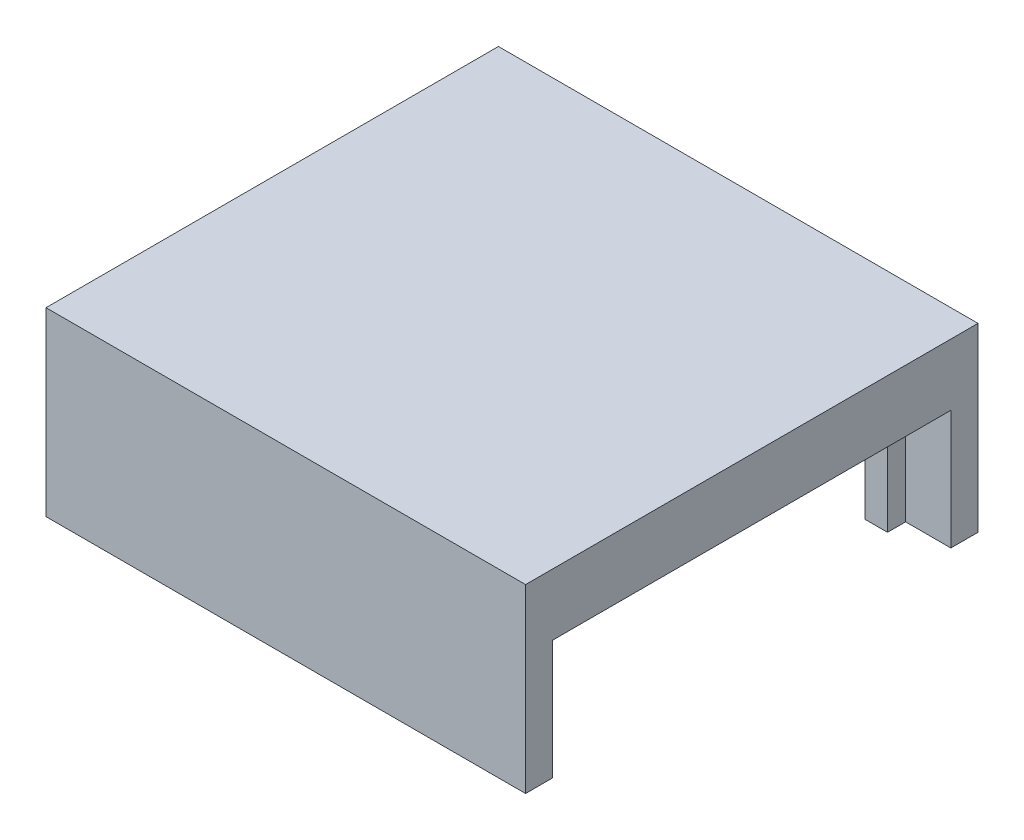
ISO-10303-21;
HEADER;
FILE_DESCRIPTION(('STEP AP214'),'2;1');
FILE_NAME('part.step','',(''),(''),'','','');
FILE_SCHEMA(('AUTOMOTIVE_DESIGN { 1 0 10303 214 1 1 1 1 }'));
ENDSEC;
DATA;
#1=APPLICATION_CONTEXT('core data for automotive mechanical design processes');
#2=APPLICATION_PROTOCOL_DEFINITION('international standard','automotive_design',2000,#1);
#3=PRODUCT_CONTEXT('',#1,'mechanical');
#4=PRODUCT('Part','Part','',(#3));
#5=PRODUCT_RELATED_PRODUCT_CATEGORY('part','',(#4));
#6=PRODUCT_DEFINITION_FORMATION('','',#4);
#7=PRODUCT_DEFINITION_CONTEXT('part definition',#1,'design');
#8=PRODUCT_DEFINITION('design','',#6,#7);
#9=PRODUCT_DEFINITION_SHAPE('','',#8);
#10=(LENGTH_UNIT() NAMED_UNIT(*) SI_UNIT(.MILLI.,.METRE.));
#11=(NAMED_UNIT(*) PLANE_ANGLE_UNIT() SI_UNIT($,.RADIAN.));
#12=(NAMED_UNIT(*) SI_UNIT($,.STERADIAN.) SOLID_ANGLE_UNIT());
#13=UNCERTAINTY_MEASURE_WITH_UNIT(LENGTH_MEASURE(1.E-05),#10,'distance_accuracy_value','');
#14=(GEOMETRIC_REPRESENTATION_CONTEXT(3) GLOBAL_UNCERTAINTY_ASSIGNED_CONTEXT((#13)) GLOBAL_UNIT_ASSIGNED_CONTEXT((#10,
#11,#12)) REPRESENTATION_CONTEXT('',''));
#15=CARTESIAN_POINT('',(0.,0.,0.));
#16=DIRECTION('',(0.,0.,1.));
#17=DIRECTION('',(1.,0.,0.));
#18=AXIS2_PLACEMENT_3D('',#15,#16,#17);
#19=CARTESIAN_POINT('',(0.,0.,0.));
#20=DIRECTION('',(0.,1.,0.));
#21=DIRECTION('',(0.,0.,1.));
#22=AXIS2_PLACEMENT_3D('',#19,#20,#21);
#23=PLANE('',#22);
#24=DIRECTION('',(-1.,0.,0.));
#25=VECTOR('',#24,1.);
#26=CARTESIAN_POINT('',(53.,0.,-50.));
#27=LINE('',#26,#25);
#28=CARTESIAN_POINT('',(-38.,0.,-50.));
#29=VERTEX_POINT('',#28);
#30=CARTESIAN_POINT('',(-53.,0.,-50.));
#31=VERTEX_POINT('',#30);
#32=EDGE_CURVE('E335',#29,#31,#27,.T.);
#33=ORIENTED_EDGE('',*,*,#32,.F.);
#34=DIRECTION('',(0.,0.,-1.));
#35=VECTOR('',#34,1.);
#36=CARTESIAN_POINT('',(-38.,0.,38.7185311582816));
#37=LINE('',#36,#35);
#38=CARTESIAN_POINT('',(-38.,0.,-40.));
#39=VERTEX_POINT('',#38);
#40=EDGE_CURVE('E200',#39,#29,#37,.T.);
#41=ORIENTED_EDGE('',*,*,#40,.F.);
#42=DIRECTION('',(1.,0.,0.));
#43=VECTOR('',#42,1.);
#44=CARTESIAN_POINT('',(-43.,0.,-40.));
#45=LINE('',#44,#43);
#46=CARTESIAN_POINT('',(-43.,0.,-40.));
#47=VERTEX_POINT('',#46);
#48=EDGE_CURVE('E281',#47,#39,#45,.T.);
#49=ORIENTED_EDGE('',*,*,#48,.F.);
#50=DIRECTION('',(0.,0.,-1.));
#51=VECTOR('',#50,1.);
#52=CARTESIAN_POINT('',(-43.,0.,-45.));
#53=LINE('',#52,#51);
#54=CARTESIAN_POINT('',(-43.,0.,-45.));
#55=VERTEX_POINT('',#54);
#56=EDGE_CURVE('E229',#47,#55,#53,.T.);
#57=ORIENTED_EDGE('',*,*,#56,.T.);
#58=DIRECTION('',(-1.,0.,0.));
#59=VECTOR('',#58,1.);
#60=CARTESIAN_POINT('',(53.0666262289621,0.,-45.));
#61=LINE('',#60,#59);
#62=CARTESIAN_POINT('',(-53.,0.,-45.));
#63=VERTEX_POINT('',#62);
#64=EDGE_CURVE('E237',#55,#63,#61,.T.);
#65=ORIENTED_EDGE('',*,*,#64,.T.);
#66=DIRECTION('',(0.,0.,1.));
#67=VECTOR('',#66,1.);
#68=CARTESIAN_POINT('',(-53.,0.,50.));
#69=LINE('',#68,#67);
#70=EDGE_CURVE('E326',#31,#63,#69,.T.);
#71=ORIENTED_EDGE('',*,*,#70,.F.);
#72=EDGE_LOOP('',(#33,#41,#49,#57,#65,#71));
#73=FACE_BOUND('',#72,.T.);
#74=ADVANCED_FACE('F35',(#73),#23,.F.);
#75=CARTESIAN_POINT('',(38.,0.,-40.));
#76=VERTEX_POINT('',#75);
#77=CARTESIAN_POINT('',(43.,0.,-40.));
#78=VERTEX_POINT('',#77);
#79=EDGE_CURVE('E285',#76,#78,#45,.T.);
#80=ORIENTED_EDGE('',*,*,#79,.F.);
#81=DIRECTION('',(0.,0.,-1.));
#82=VECTOR('',#81,1.);
#83=CARTESIAN_POINT('',(38.,0.,38.7185311582816));
#84=LINE('',#83,#82);
#85=CARTESIAN_POINT('',(38.,0.,-50.));
#86=VERTEX_POINT('',#85);
#87=EDGE_CURVE('E212',#76,#86,#84,.T.);
#88=ORIENTED_EDGE('',*,*,#87,.T.);
#89=CARTESIAN_POINT('',(53.,0.,-50.));
#90=VERTEX_POINT('',#89);
#91=EDGE_CURVE('E319',#90,#86,#27,.T.);
#92=ORIENTED_EDGE('',*,*,#91,.F.);
#93=DIRECTION('',(0.,0.,-1.));
#94=VECTOR('',#93,1.);
#95=CARTESIAN_POINT('',(53.,0.,50.));
#96=LINE('',#95,#94);
#97=CARTESIAN_POINT('',(53.,0.,-44.));
#98=VERTEX_POINT('',#97);
#99=EDGE_CURVE('E331',#98,#90,#96,.T.);
#100=ORIENTED_EDGE('',*,*,#99,.F.);
#101=DIRECTION('',(1.,0.,0.));
#102=VECTOR('',#101,1.);
#103=CARTESIAN_POINT('',(-48.8626192298182,0.,-44.));
#104=LINE('',#103,#102);
#105=CARTESIAN_POINT('',(43.,0.,-44.));
#106=VERTEX_POINT('',#105);
#107=EDGE_CURVE('E264',#106,#98,#104,.T.);
#108=ORIENTED_EDGE('',*,*,#107,.F.);
#109=DIRECTION('',(0.,0.,1.));
#110=VECTOR('',#109,1.);
#111=CARTESIAN_POINT('',(43.,0.,44.));
#112=LINE('',#111,#110);
#113=EDGE_CURVE('E268',#106,#78,#112,.T.);
#114=ORIENTED_EDGE('',*,*,#113,.T.);
#115=EDGE_LOOP('',(#80,#88,#92,#100,#108,#114));
#116=FACE_BOUND('',#115,.T.);
#117=ADVANCED_FACE('F413',(#116),#23,.F.);
#118=CARTESIAN_POINT('',(-53.,40.,50.));
#119=DIRECTION('',(1.,0.,0.));
#120=DIRECTION('',(0.,0.,-1.));
#121=AXIS2_PLACEMENT_3D('',#118,#119,#120);
#122=PLANE('',#121);
#123=ORIENTED_EDGE('',*,*,#70,.T.);
#124=DIRECTION('',(0.,-1.,0.));
#125=VECTOR('',#124,1.);
#126=CARTESIAN_POINT('',(-53.,0.,-45.));
#127=LINE('',#126,#125);
#128=CARTESIAN_POINT('',(-53.,33.5975694807689,-45.));
#129=VERTEX_POINT('',#128);
#130=EDGE_CURVE('E217',#129,#63,#127,.T.);
#131=ORIENTED_EDGE('',*,*,#130,.F.);
#132=DIRECTION('',(0.,0.,-1.));
#133=VECTOR('',#132,1.);
#134=CARTESIAN_POINT('',(-53.,33.5975694807689,-45.));
#135=LINE('',#134,#133);
#136=CARTESIAN_POINT('',(-53.,33.5975694807689,45.));
#137=VERTEX_POINT('',#136);
#138=EDGE_CURVE('E234',#137,#129,#135,.T.);
#139=ORIENTED_EDGE('',*,*,#138,.F.);
#140=DIRECTION('',(0.,1.,0.));
#141=VECTOR('',#140,1.);
#142=CARTESIAN_POINT('',(-53.,0.,45.));
#143=LINE('',#142,#141);
#144=CARTESIAN_POINT('',(-53.,0.,45.));
#145=VERTEX_POINT('',#144);
#146=EDGE_CURVE('E231',#145,#137,#143,.T.);
#147=ORIENTED_EDGE('',*,*,#146,.F.);
#148=CARTESIAN_POINT('',(-53.,0.,50.));
#149=VERTEX_POINT('',#148);
#150=EDGE_CURVE('E314',#145,#149,#69,.T.);
#151=ORIENTED_EDGE('',*,*,#150,.T.);
#152=DIRECTION('',(0.,-1.,0.));
#153=VECTOR('',#152,1.);
#154=CARTESIAN_POINT('',(-53.,40.,50.));
#155=LINE('',#154,#153);
#156=CARTESIAN_POINT('',(-53.,40.,50.));
#157=VERTEX_POINT('',#156);
#158=EDGE_CURVE('E43',#157,#149,#155,.T.);
#159=ORIENTED_EDGE('',*,*,#158,.F.);
#160=DIRECTION('',(0.,0.,1.));
#161=VECTOR('',#160,1.);
#162=CARTESIAN_POINT('',(-53.,40.,50.));
#163=LINE('',#162,#161);
#164=CARTESIAN_POINT('',(-53.,40.,-50.));
#165=VERTEX_POINT('',#164);
#166=EDGE_CURVE('E315',#165,#157,#163,.T.);
#167=ORIENTED_EDGE('',*,*,#166,.F.);
#168=DIRECTION('',(0.,-1.,0.));
#169=VECTOR('',#168,1.);
#170=CARTESIAN_POINT('',(-53.,40.,-50.));
#171=LINE('',#170,#169);
#172=EDGE_CURVE('E325',#165,#31,#171,.T.);
#173=ORIENTED_EDGE('',*,*,#172,.T.);
#174=EDGE_LOOP('',(#123,#131,#139,#147,#151,#159,#167,#173));
#175=FACE_BOUND('',#174,.T.);
#176=ADVANCED_FACE('F37',(#175),#122,.F.);
#177=CARTESIAN_POINT('',(53.,40.,50.));
#178=DIRECTION('',(0.,0.,-1.));
#179=DIRECTION('',(-1.,0.,0.));
#180=AXIS2_PLACEMENT_3D('',#177,#178,#179);
#181=PLANE('',#180);
#182=DIRECTION('',(1.,0.,0.));
#183=VECTOR('',#182,1.);
#184=CARTESIAN_POINT('',(53.,0.,50.));
#185=LINE('',#184,#183);
#186=CARTESIAN_POINT('',(53.,0.,50.));
#187=VERTEX_POINT('',#186);
#188=EDGE_CURVE('E329',#149,#187,#185,.T.);
#189=ORIENTED_EDGE('',*,*,#188,.T.);
#190=DIRECTION('',(0.,-1.,0.));
#191=VECTOR('',#190,1.);
#192=CARTESIAN_POINT('',(53.,40.,50.));
#193=LINE('',#192,#191);
#194=CARTESIAN_POINT('',(53.,40.,50.));
#195=VERTEX_POINT('',#194);
#196=EDGE_CURVE('E342',#195,#187,#193,.T.);
#197=ORIENTED_EDGE('',*,*,#196,.F.);
#198=DIRECTION('',(1.,0.,0.));
#199=VECTOR('',#198,1.);
#200=CARTESIAN_POINT('',(53.,40.,50.));
#201=LINE('',#200,#199);
#202=EDGE_CURVE('E318',#157,#195,#201,.T.);
#203=ORIENTED_EDGE('',*,*,#202,.F.);
#204=ORIENTED_EDGE('',*,*,#158,.T.);
#205=EDGE_LOOP('',(#189,#197,#203,#204));
#206=FACE_BOUND('',#205,.T.);
#207=ADVANCED_FACE('F347',(#206),#181,.F.);
#208=CARTESIAN_POINT('',(53.,40.,50.));
#209=DIRECTION('',(-1.,0.,0.));
#210=DIRECTION('',(0.,0.,1.));
#211=AXIS2_PLACEMENT_3D('',#208,#209,#210);
#212=PLANE('',#211);
#213=CARTESIAN_POINT('',(53.,0.,44.));
#214=VERTEX_POINT('',#213);
#215=EDGE_CURVE('E332',#187,#214,#96,.T.);
#216=ORIENTED_EDGE('',*,*,#215,.T.);
#217=DIRECTION('',(0.,1.,0.));
#218=VECTOR('',#217,1.);
#219=CARTESIAN_POINT('',(53.,40.,44.));
#220=LINE('',#219,#218);
#221=CARTESIAN_POINT('',(53.,26.3579364094113,44.));
#222=VERTEX_POINT('',#221);
#223=EDGE_CURVE('E277',#214,#222,#220,.T.);
#224=ORIENTED_EDGE('',*,*,#223,.T.);
#225=DIRECTION('',(0.,0.,-1.));
#226=VECTOR('',#225,1.);
#227=CARTESIAN_POINT('',(53.,26.3579364094113,50.));
#228=LINE('',#227,#226);
#229=CARTESIAN_POINT('',(53.,26.3579364094113,-44.));
#230=VERTEX_POINT('',#229);
#231=EDGE_CURVE('E271',#222,#230,#228,.T.);
#232=ORIENTED_EDGE('',*,*,#231,.T.);
#233=DIRECTION('',(0.,-1.,0.));
#234=VECTOR('',#233,1.);
#235=CARTESIAN_POINT('',(53.,40.,-44.));
#236=LINE('',#235,#234);
#237=EDGE_CURVE('E274',#230,#98,#236,.T.);
#238=ORIENTED_EDGE('',*,*,#237,.T.);
#239=ORIENTED_EDGE('',*,*,#99,.T.);
#240=DIRECTION('',(0.,-1.,0.));
#241=VECTOR('',#240,1.);
#242=CARTESIAN_POINT('',(53.,40.,-50.));
#243=LINE('',#242,#241);
#244=CARTESIAN_POINT('',(53.,40.,-50.));
#245=VERTEX_POINT('',#244);
#246=EDGE_CURVE('E339',#245,#90,#243,.T.);
#247=ORIENTED_EDGE('',*,*,#246,.F.);
#248=DIRECTION('',(0.,0.,-1.));
#249=VECTOR('',#248,1.);
#250=CARTESIAN_POINT('',(53.,40.,50.));
#251=LINE('',#250,#249);
#252=EDGE_CURVE('E321',#195,#245,#251,.T.);
#253=ORIENTED_EDGE('',*,*,#252,.F.);
#254=ORIENTED_EDGE('',*,*,#196,.T.);
#255=EDGE_LOOP('',(#216,#224,#232,#238,#239,#247,#253,#254));
#256=FACE_BOUND('',#255,.T.);
#257=ADVANCED_FACE('F362',(#256),#212,.F.);
#258=CARTESIAN_POINT('',(53.,40.,-50.));
#259=DIRECTION('',(0.,0.,1.));
#260=DIRECTION('',(1.,0.,0.));
#261=AXIS2_PLACEMENT_3D('',#258,#259,#260);
#262=PLANE('',#261);
#263=DIRECTION('',(1.,0.,0.));
#264=VECTOR('',#263,1.);
#265=CARTESIAN_POINT('',(-38.,20.5087090699868,-50.));
#266=LINE('',#265,#264);
#267=CARTESIAN_POINT('',(-38.,20.5087090699868,-50.));
#268=VERTEX_POINT('',#267);
#269=CARTESIAN_POINT('',(38.,20.5087090699868,-50.));
#270=VERTEX_POINT('',#269);
#271=EDGE_CURVE('E188',#268,#270,#266,.T.);
#272=ORIENTED_EDGE('',*,*,#271,.F.);
#273=DIRECTION('',(0.,1.,0.));
#274=VECTOR('',#273,1.);
#275=CARTESIAN_POINT('',(-38.,0.,-50.));
#276=LINE('',#275,#274);
#277=EDGE_CURVE('E197',#29,#268,#276,.T.);
#278=ORIENTED_EDGE('',*,*,#277,.F.);
#279=ORIENTED_EDGE('',*,*,#32,.T.);
#280=ORIENTED_EDGE('',*,*,#172,.F.);
#281=DIRECTION('',(-1.,0.,0.));
#282=VECTOR('',#281,1.);
#283=CARTESIAN_POINT('',(53.,40.,-50.));
#284=LINE('',#283,#282);
#285=EDGE_CURVE('E323',#245,#165,#284,.T.);
#286=ORIENTED_EDGE('',*,*,#285,.F.);
#287=ORIENTED_EDGE('',*,*,#246,.T.);
#288=ORIENTED_EDGE('',*,*,#91,.T.);
#289=DIRECTION('',(0.,-1.,0.));
#290=VECTOR('',#289,1.);
#291=CARTESIAN_POINT('',(38.,0.,-50.));
#292=LINE('',#291,#290);
#293=EDGE_CURVE('E194',#270,#86,#292,.T.);
#294=ORIENTED_EDGE('',*,*,#293,.F.);
#295=EDGE_LOOP('',(#272,#278,#279,#280,#286,#287,#288,#294));
#296=FACE_BOUND('',#295,.T.);
#297=ADVANCED_FACE('F204',(#296),#262,.F.);
#298=CARTESIAN_POINT('',(0.,40.,0.));
#299=DIRECTION('',(0.,1.,0.));
#300=DIRECTION('',(0.,0.,1.));
#301=AXIS2_PLACEMENT_3D('',#298,#299,#300);
#302=PLANE('',#301);
#303=ORIENTED_EDGE('',*,*,#166,.T.);
#304=ORIENTED_EDGE('',*,*,#202,.T.);
#305=ORIENTED_EDGE('',*,*,#252,.T.);
#306=ORIENTED_EDGE('',*,*,#285,.T.);
#307=EDGE_LOOP('',(#303,#304,#305,#306));
#308=FACE_BOUND('',#307,.T.);
#309=ADVANCED_FACE('F367',(#308),#302,.T.);
#310=ORIENTED_EDGE('',*,*,#150,.F.);
#311=DIRECTION('',(-1.,0.,0.));
#312=VECTOR('',#311,1.);
#313=CARTESIAN_POINT('',(53.0666262289621,0.,45.));
#314=LINE('',#313,#312);
#315=CARTESIAN_POINT('',(-43.,0.,45.));
#316=VERTEX_POINT('',#315);
#317=EDGE_CURVE('E241',#316,#145,#314,.T.);
#318=ORIENTED_EDGE('',*,*,#317,.F.);
#319=CARTESIAN_POINT('',(-43.,0.,40.));
#320=VERTEX_POINT('',#319);
#321=EDGE_CURVE('E245',#316,#320,#53,.T.);
#322=ORIENTED_EDGE('',*,*,#321,.T.);
#323=DIRECTION('',(-1.,0.,0.));
#324=VECTOR('',#323,1.);
#325=CARTESIAN_POINT('',(-43.,0.,40.));
#326=LINE('',#325,#324);
#327=CARTESIAN_POINT('',(43.,0.,40.));
#328=VERTEX_POINT('',#327);
#329=EDGE_CURVE('E280',#328,#320,#326,.T.);
#330=ORIENTED_EDGE('',*,*,#329,.F.);
#331=CARTESIAN_POINT('',(43.,0.,44.));
#332=VERTEX_POINT('',#331);
#333=EDGE_CURVE('E258',#328,#332,#112,.T.);
#334=ORIENTED_EDGE('',*,*,#333,.T.);
#335=DIRECTION('',(1.,0.,0.));
#336=VECTOR('',#335,1.);
#337=CARTESIAN_POINT('',(-48.8626192298182,0.,44.));
#338=LINE('',#337,#336);
#339=EDGE_CURVE('E250',#332,#214,#338,.T.);
#340=ORIENTED_EDGE('',*,*,#339,.T.);
#341=ORIENTED_EDGE('',*,*,#215,.F.);
#342=ORIENTED_EDGE('',*,*,#188,.F.);
#343=EDGE_LOOP('',(#310,#318,#322,#330,#334,#340,#341,#342));
#344=FACE_BOUND('',#343,.T.);
#345=ADVANCED_FACE('F358',(#344),#23,.F.);
#346=CARTESIAN_POINT('',(0.,35.,0.));
#347=DIRECTION('',(0.,1.,0.));
#348=DIRECTION('',(0.,0.,1.));
#349=AXIS2_PLACEMENT_3D('',#346,#347,#348);
#350=PLANE('',#349);
#351=DIRECTION('',(0.,0.,1.));
#352=VECTOR('',#351,1.);
#353=CARTESIAN_POINT('',(43.,35.,40.));
#354=LINE('',#353,#352);
#355=CARTESIAN_POINT('',(43.,35.,-40.));
#356=VERTEX_POINT('',#355);
#357=CARTESIAN_POINT('',(43.,35.,40.));
#358=VERTEX_POINT('',#357);
#359=EDGE_CURVE('E291',#356,#358,#354,.T.);
#360=ORIENTED_EDGE('',*,*,#359,.T.);
#361=DIRECTION('',(-1.,0.,0.));
#362=VECTOR('',#361,1.);
#363=CARTESIAN_POINT('',(-43.,35.,40.));
#364=LINE('',#363,#362);
#365=CARTESIAN_POINT('',(-43.,35.,40.));
#366=VERTEX_POINT('',#365);
#367=EDGE_CURVE('E284',#358,#366,#364,.T.);
#368=ORIENTED_EDGE('',*,*,#367,.T.);
#369=DIRECTION('',(0.,0.,-1.));
#370=VECTOR('',#369,1.);
#371=CARTESIAN_POINT('',(-43.,35.,40.));
#372=LINE('',#371,#370);
#373=CARTESIAN_POINT('',(-43.,35.,-40.));
#374=VERTEX_POINT('',#373);
#375=EDGE_CURVE('E301',#366,#374,#372,.T.);
#376=ORIENTED_EDGE('',*,*,#375,.T.);
#377=DIRECTION('',(1.,0.,0.));
#378=VECTOR('',#377,1.);
#379=CARTESIAN_POINT('',(-43.,35.,-40.));
#380=LINE('',#379,#378);
#381=EDGE_CURVE('E296',#374,#356,#380,.T.);
#382=ORIENTED_EDGE('',*,*,#381,.T.);
#383=EDGE_LOOP('',(#360,#368,#376,#382));
#384=FACE_BOUND('',#383,.T.);
#385=ADVANCED_FACE('F439',(#384),#350,.F.);
#386=CARTESIAN_POINT('',(-43.,157.456374880208,40.));
#387=DIRECTION('',(0.,0.,1.));
#388=DIRECTION('',(1.,0.,0.));
#389=AXIS2_PLACEMENT_3D('',#386,#387,#388);
#390=PLANE('',#389);
#391=DIRECTION('',(0.,-1.,0.));
#392=VECTOR('',#391,1.);
#393=CARTESIAN_POINT('',(43.,157.456374880208,40.));
#394=LINE('',#393,#392);
#395=CARTESIAN_POINT('',(43.,26.3579364094113,40.));
#396=VERTEX_POINT('',#395);
#397=EDGE_CURVE('E311',#358,#396,#394,.T.);
#398=ORIENTED_EDGE('',*,*,#397,.T.);
#399=EDGE_CURVE('E294',#396,#328,#394,.T.);
#400=ORIENTED_EDGE('',*,*,#399,.T.);
#401=ORIENTED_EDGE('',*,*,#329,.T.);
#402=DIRECTION('',(0.,-1.,0.));
#403=VECTOR('',#402,1.);
#404=CARTESIAN_POINT('',(-43.,157.456374880208,40.));
#405=LINE('',#404,#403);
#406=CARTESIAN_POINT('',(-43.,33.5975694807689,40.));
#407=VERTEX_POINT('',#406);
#408=EDGE_CURVE('E248',#407,#320,#405,.T.);
#409=ORIENTED_EDGE('',*,*,#408,.F.);
#410=DIRECTION('',(0.,-1.,0.));
#411=VECTOR('',#410,1.);
#412=CARTESIAN_POINT('',(-43.,157.456374880208,40.));
#413=LINE('',#412,#411);
#414=EDGE_CURVE('E290',#366,#407,#413,.T.);
#415=ORIENTED_EDGE('',*,*,#414,.F.);
#416=ORIENTED_EDGE('',*,*,#367,.F.);
#417=EDGE_LOOP('',(#398,#400,#401,#409,#415,#416));
#418=FACE_BOUND('',#417,.T.);
#419=ADVANCED_FACE('F392',(#418),#390,.F.);
#420=CARTESIAN_POINT('',(-43.,157.456374880208,40.));
#421=DIRECTION('',(-1.,0.,0.));
#422=DIRECTION('',(0.,0.,1.));
#423=AXIS2_PLACEMENT_3D('',#420,#421,#422);
#424=PLANE('',#423);
#425=ORIENTED_EDGE('',*,*,#414,.T.);
#426=DIRECTION('',(0.,0.,1.));
#427=VECTOR('',#426,1.);
#428=CARTESIAN_POINT('',(-43.,33.5975694807689,-45.));
#429=LINE('',#428,#427);
#430=CARTESIAN_POINT('',(-43.,33.5975694807689,-40.));
#431=VERTEX_POINT('',#430);
#432=EDGE_CURVE('E227',#431,#407,#429,.T.);
#433=ORIENTED_EDGE('',*,*,#432,.F.);
#434=DIRECTION('',(0.,-1.,0.));
#435=VECTOR('',#434,1.);
#436=CARTESIAN_POINT('',(-43.,157.456374880208,-40.));
#437=LINE('',#436,#435);
#438=EDGE_CURVE('E300',#374,#431,#437,.T.);
#439=ORIENTED_EDGE('',*,*,#438,.F.);
#440=ORIENTED_EDGE('',*,*,#375,.F.);
#441=EDGE_LOOP('',(#425,#433,#439,#440));
#442=FACE_BOUND('',#441,.T.);
#443=ADVANCED_FACE('F454',(#442),#424,.F.);
#444=CARTESIAN_POINT('',(-43.,157.456374880208,-40.));
#445=DIRECTION('',(0.,0.,-1.));
#446=DIRECTION('',(-1.,0.,0.));
#447=AXIS2_PLACEMENT_3D('',#444,#445,#446);
#448=PLANE('',#447);
#449=ORIENTED_EDGE('',*,*,#48,.T.);
#450=DIRECTION('',(0.,-1.,0.));
#451=VECTOR('',#450,1.);
#452=CARTESIAN_POINT('',(-38.,0.,-40.));
#453=LINE('',#452,#451);
#454=CARTESIAN_POINT('',(-38.,20.5087090699868,-40.));
#455=VERTEX_POINT('',#454);
#456=EDGE_CURVE('E218',#455,#39,#453,.T.);
#457=ORIENTED_EDGE('',*,*,#456,.F.);
#458=DIRECTION('',(-1.,0.,0.));
#459=VECTOR('',#458,1.);
#460=CARTESIAN_POINT('',(-38.,20.5087090699868,-40.));
#461=LINE('',#460,#459);
#462=CARTESIAN_POINT('',(38.,20.5087090699868,-40.));
#463=VERTEX_POINT('',#462);
#464=EDGE_CURVE('E191',#463,#455,#461,.T.);
#465=ORIENTED_EDGE('',*,*,#464,.F.);
#466=DIRECTION('',(0.,1.,0.));
#467=VECTOR('',#466,1.);
#468=CARTESIAN_POINT('',(38.,0.,-40.));
#469=LINE('',#468,#467);
#470=EDGE_CURVE('E211',#76,#463,#469,.T.);
#471=ORIENTED_EDGE('',*,*,#470,.F.);
#472=ORIENTED_EDGE('',*,*,#79,.T.);
#473=DIRECTION('',(0.,-1.,0.));
#474=VECTOR('',#473,1.);
#475=CARTESIAN_POINT('',(43.,157.456374880208,-40.));
#476=LINE('',#475,#474);
#477=CARTESIAN_POINT('',(43.,26.3579364094113,-40.));
#478=VERTEX_POINT('',#477);
#479=EDGE_CURVE('E299',#478,#78,#476,.T.);
#480=ORIENTED_EDGE('',*,*,#479,.F.);
#481=EDGE_CURVE('E295',#356,#478,#476,.T.);
#482=ORIENTED_EDGE('',*,*,#481,.F.);
#483=ORIENTED_EDGE('',*,*,#381,.F.);
#484=ORIENTED_EDGE('',*,*,#438,.T.);
#485=EDGE_CURVE('E304',#431,#47,#437,.T.);
#486=ORIENTED_EDGE('',*,*,#485,.T.);
#487=EDGE_LOOP('',(#449,#457,#465,#471,#472,#480,#482,#483,#484,#486));
#488=FACE_BOUND('',#487,.T.);
#489=ADVANCED_FACE('F405',(#488),#448,.F.);
#490=CARTESIAN_POINT('',(43.,157.456374880208,40.));
#491=DIRECTION('',(1.,0.,0.));
#492=DIRECTION('',(0.,0.,-1.));
#493=AXIS2_PLACEMENT_3D('',#490,#491,#492);
#494=PLANE('',#493);
#495=ORIENTED_EDGE('',*,*,#481,.T.);
#496=DIRECTION('',(0.,0.,1.));
#497=VECTOR('',#496,1.);
#498=CARTESIAN_POINT('',(43.,26.3579364094113,40.));
#499=LINE('',#498,#497);
#500=EDGE_CURVE('E12',#478,#396,#499,.T.);
#501=ORIENTED_EDGE('',*,*,#500,.T.);
#502=ORIENTED_EDGE('',*,*,#397,.F.);
#503=ORIENTED_EDGE('',*,*,#359,.F.);
#504=EDGE_LOOP('',(#495,#501,#502,#503));
#505=FACE_BOUND('',#504,.T.);
#506=ADVANCED_FACE('F398',(#505),#494,.F.);
#507=CARTESIAN_POINT('',(-48.8626192298182,0.,44.));
#508=DIRECTION('',(0.,0.,1.));
#509=DIRECTION('',(1.,0.,0.));
#510=AXIS2_PLACEMENT_3D('',#507,#508,#509);
#511=PLANE('',#510);
#512=ORIENTED_EDGE('',*,*,#339,.F.);
#513=DIRECTION('',(0.,1.,0.));
#514=VECTOR('',#513,1.);
#515=CARTESIAN_POINT('',(43.,0.,44.));
#516=LINE('',#515,#514);
#517=CARTESIAN_POINT('',(43.,26.3579364094113,44.));
#518=VERTEX_POINT('',#517);
#519=EDGE_CURVE('E256',#332,#518,#516,.T.);
#520=ORIENTED_EDGE('',*,*,#519,.T.);
#521=DIRECTION('',(1.,0.,0.));
#522=VECTOR('',#521,1.);
#523=CARTESIAN_POINT('',(-48.8626192298182,26.3579364094113,44.));
#524=LINE('',#523,#522);
#525=EDGE_CURVE('E254',#518,#222,#524,.T.);
#526=ORIENTED_EDGE('',*,*,#525,.T.);
#527=ORIENTED_EDGE('',*,*,#223,.F.);
#528=EDGE_LOOP('',(#512,#520,#526,#527));
#529=FACE_BOUND('',#528,.T.);
#530=ADVANCED_FACE('F420',(#529),#511,.F.);
#531=CARTESIAN_POINT('',(-48.8626192298182,0.,-44.));
#532=DIRECTION('',(0.,0.,-1.));
#533=DIRECTION('',(-1.,0.,0.));
#534=AXIS2_PLACEMENT_3D('',#531,#532,#533);
#535=PLANE('',#534);
#536=DIRECTION('',(1.,0.,0.));
#537=VECTOR('',#536,1.);
#538=CARTESIAN_POINT('',(-48.8626192298182,26.3579364094113,-44.));
#539=LINE('',#538,#537);
#540=CARTESIAN_POINT('',(43.,26.3579364094113,-44.));
#541=VERTEX_POINT('',#540);
#542=EDGE_CURVE('E261',#541,#230,#539,.T.);
#543=ORIENTED_EDGE('',*,*,#542,.F.);
#544=DIRECTION('',(0.,-1.,0.));
#545=VECTOR('',#544,1.);
#546=CARTESIAN_POINT('',(43.,0.,-44.));
#547=LINE('',#546,#545);
#548=EDGE_CURVE('E251',#541,#106,#547,.T.);
#549=ORIENTED_EDGE('',*,*,#548,.T.);
#550=ORIENTED_EDGE('',*,*,#107,.T.);
#551=ORIENTED_EDGE('',*,*,#237,.F.);
#552=EDGE_LOOP('',(#543,#549,#550,#551));
#553=FACE_BOUND('',#552,.T.);
#554=ADVANCED_FACE('F418',(#553),#535,.F.);
#555=CARTESIAN_POINT('',(43.,157.456374880208,40.));
#556=DIRECTION('',(1.,0.,0.));
#557=DIRECTION('',(0.,0.,-1.));
#558=AXIS2_PLACEMENT_3D('',#555,#556,#557);
#559=PLANE('',#558);
#560=ORIENTED_EDGE('',*,*,#399,.F.);
#561=DIRECTION('',(0.,0.,-1.));
#562=VECTOR('',#561,1.);
#563=CARTESIAN_POINT('',(43.,26.3579364094113,44.));
#564=LINE('',#563,#562);
#565=EDGE_CURVE('E58',#518,#396,#564,.T.);
#566=ORIENTED_EDGE('',*,*,#565,.F.);
#567=ORIENTED_EDGE('',*,*,#519,.F.);
#568=ORIENTED_EDGE('',*,*,#333,.F.);
#569=EDGE_LOOP('',(#560,#566,#567,#568));
#570=FACE_BOUND('',#569,.T.);
#571=ADVANCED_FACE('F396',(#570),#559,.T.);
#572=ORIENTED_EDGE('',*,*,#479,.T.);
#573=ORIENTED_EDGE('',*,*,#113,.F.);
#574=ORIENTED_EDGE('',*,*,#548,.F.);
#575=EDGE_CURVE('E253',#478,#541,#564,.T.);
#576=ORIENTED_EDGE('',*,*,#575,.F.);
#577=EDGE_LOOP('',(#572,#573,#574,#576));
#578=FACE_BOUND('',#577,.T.);
#579=ADVANCED_FACE('F410',(#578),#559,.T.);
#580=CARTESIAN_POINT('',(-48.8626192298182,26.3579364094113,44.));
#581=DIRECTION('',(0.,1.,0.));
#582=DIRECTION('',(0.,0.,1.));
#583=AXIS2_PLACEMENT_3D('',#580,#581,#582);
#584=PLANE('',#583);
#585=ORIENTED_EDGE('',*,*,#525,.F.);
#586=ORIENTED_EDGE('',*,*,#565,.T.);
#587=ORIENTED_EDGE('',*,*,#500,.F.);
#588=ORIENTED_EDGE('',*,*,#575,.T.);
#589=ORIENTED_EDGE('',*,*,#542,.T.);
#590=ORIENTED_EDGE('',*,*,#231,.F.);
#591=EDGE_LOOP('',(#585,#586,#587,#588,#589,#590));
#592=FACE_BOUND('',#591,.T.);
#593=ADVANCED_FACE('F401',(#592),#584,.F.);
#594=CARTESIAN_POINT('',(-43.,157.456374880208,40.));
#595=DIRECTION('',(-1.,0.,0.));
#596=DIRECTION('',(0.,0.,1.));
#597=AXIS2_PLACEMENT_3D('',#594,#595,#596);
#598=PLANE('',#597);
#599=ORIENTED_EDGE('',*,*,#408,.T.);
#600=ORIENTED_EDGE('',*,*,#321,.F.);
#601=DIRECTION('',(0.,-1.,0.));
#602=VECTOR('',#601,1.);
#603=CARTESIAN_POINT('',(-43.,0.,45.));
#604=LINE('',#603,#602);
#605=CARTESIAN_POINT('',(-43.,33.5975694807689,45.));
#606=VERTEX_POINT('',#605);
#607=EDGE_CURVE('E219',#606,#316,#604,.T.);
#608=ORIENTED_EDGE('',*,*,#607,.F.);
#609=EDGE_CURVE('E221',#407,#606,#429,.T.);
#610=ORIENTED_EDGE('',*,*,#609,.F.);
#611=EDGE_LOOP('',(#599,#600,#608,#610));
#612=FACE_BOUND('',#611,.T.);
#613=ADVANCED_FACE('F493',(#612),#598,.T.);
#614=ORIENTED_EDGE('',*,*,#485,.F.);
#615=CARTESIAN_POINT('',(-43.,33.5975694807689,-45.));
#616=VERTEX_POINT('',#615);
#617=EDGE_CURVE('E223',#616,#431,#429,.T.);
#618=ORIENTED_EDGE('',*,*,#617,.F.);
#619=DIRECTION('',(0.,1.,0.));
#620=VECTOR('',#619,1.);
#621=CARTESIAN_POINT('',(-43.,0.,-45.));
#622=LINE('',#621,#620);
#623=EDGE_CURVE('E226',#55,#616,#622,.T.);
#624=ORIENTED_EDGE('',*,*,#623,.F.);
#625=ORIENTED_EDGE('',*,*,#56,.F.);
#626=EDGE_LOOP('',(#614,#618,#624,#625));
#627=FACE_BOUND('',#626,.T.);
#628=ADVANCED_FACE('F496',(#627),#598,.T.);
#629=CARTESIAN_POINT('',(53.0666262289621,0.,-45.));
#630=DIRECTION('',(0.,0.,-1.));
#631=DIRECTION('',(-1.,0.,0.));
#632=AXIS2_PLACEMENT_3D('',#629,#630,#631);
#633=PLANE('',#632);
#634=ORIENTED_EDGE('',*,*,#623,.T.);
#635=DIRECTION('',(-1.,0.,0.));
#636=VECTOR('',#635,1.);
#637=CARTESIAN_POINT('',(53.0666262289621,33.5975694807689,-45.));
#638=LINE('',#637,#636);
#639=EDGE_CURVE('E222',#616,#129,#638,.T.);
#640=ORIENTED_EDGE('',*,*,#639,.T.);
#641=ORIENTED_EDGE('',*,*,#130,.T.);
#642=ORIENTED_EDGE('',*,*,#64,.F.);
#643=EDGE_LOOP('',(#634,#640,#641,#642));
#644=FACE_BOUND('',#643,.T.);
#645=ADVANCED_FACE('F376',(#644),#633,.F.);
#646=CARTESIAN_POINT('',(53.0666262289621,33.5975694807689,-45.));
#647=DIRECTION('',(0.,1.,0.));
#648=DIRECTION('',(0.,0.,1.));
#649=AXIS2_PLACEMENT_3D('',#646,#647,#648);
#650=PLANE('',#649);
#651=ORIENTED_EDGE('',*,*,#617,.T.);
#652=ORIENTED_EDGE('',*,*,#432,.T.);
#653=ORIENTED_EDGE('',*,*,#609,.T.);
#654=DIRECTION('',(-1.,0.,0.));
#655=VECTOR('',#654,1.);
#656=CARTESIAN_POINT('',(53.0666262289621,33.5975694807689,45.));
#657=LINE('',#656,#655);
#658=EDGE_CURVE('E239',#606,#137,#657,.T.);
#659=ORIENTED_EDGE('',*,*,#658,.T.);
#660=ORIENTED_EDGE('',*,*,#138,.T.);
#661=ORIENTED_EDGE('',*,*,#639,.F.);
#662=EDGE_LOOP('',(#651,#652,#653,#659,#660,#661));
#663=FACE_BOUND('',#662,.T.);
#664=ADVANCED_FACE('F380',(#663),#650,.F.);
#665=CARTESIAN_POINT('',(53.0666262289621,0.,45.));
#666=DIRECTION('',(0.,0.,1.));
#667=DIRECTION('',(1.,0.,0.));
#668=AXIS2_PLACEMENT_3D('',#665,#666,#667);
#669=PLANE('',#668);
#670=ORIENTED_EDGE('',*,*,#607,.T.);
#671=ORIENTED_EDGE('',*,*,#317,.T.);
#672=ORIENTED_EDGE('',*,*,#146,.T.);
#673=ORIENTED_EDGE('',*,*,#658,.F.);
#674=EDGE_LOOP('',(#670,#671,#672,#673));
#675=FACE_BOUND('',#674,.T.);
#676=ADVANCED_FACE('F385',(#675),#669,.F.);
#677=CARTESIAN_POINT('',(-38.,0.,38.7185311582816));
#678=DIRECTION('',(-1.,0.,0.));
#679=DIRECTION('',(0.,0.,1.));
#680=AXIS2_PLACEMENT_3D('',#677,#678,#679);
#681=PLANE('',#680);
#682=ORIENTED_EDGE('',*,*,#456,.T.);
#683=ORIENTED_EDGE('',*,*,#40,.T.);
#684=ORIENTED_EDGE('',*,*,#277,.T.);
#685=DIRECTION('',(0.,0.,-1.));
#686=VECTOR('',#685,1.);
#687=CARTESIAN_POINT('',(-38.,20.5087090699868,38.7185311582816));
#688=LINE('',#687,#686);
#689=EDGE_CURVE('E184',#455,#268,#688,.T.);
#690=ORIENTED_EDGE('',*,*,#689,.F.);
#691=EDGE_LOOP('',(#682,#683,#684,#690));
#692=FACE_BOUND('',#691,.T.);
#693=ADVANCED_FACE('F198',(#692),#681,.F.);
#694=CARTESIAN_POINT('',(38.,0.,38.7185311582816));
#695=DIRECTION('',(1.,0.,0.));
#696=DIRECTION('',(0.,0.,-1.));
#697=AXIS2_PLACEMENT_3D('',#694,#695,#696);
#698=PLANE('',#697);
#699=ORIENTED_EDGE('',*,*,#470,.T.);
#700=DIRECTION('',(0.,0.,-1.));
#701=VECTOR('',#700,1.);
#702=CARTESIAN_POINT('',(38.,20.5087090699868,38.7185311582816));
#703=LINE('',#702,#701);
#704=EDGE_CURVE('E50',#463,#270,#703,.T.);
#705=ORIENTED_EDGE('',*,*,#704,.T.);
#706=ORIENTED_EDGE('',*,*,#293,.T.);
#707=ORIENTED_EDGE('',*,*,#87,.F.);
#708=EDGE_LOOP('',(#699,#705,#706,#707));
#709=FACE_BOUND('',#708,.T.);
#710=ADVANCED_FACE('F470',(#709),#698,.F.);
#711=CARTESIAN_POINT('',(-38.,20.5087090699868,38.7185311582816));
#712=DIRECTION('',(0.,1.,0.));
#713=DIRECTION('',(-1.,0.,0.));
#714=AXIS2_PLACEMENT_3D('',#711,#712,#713);
#715=PLANE('',#714);
#716=ORIENTED_EDGE('',*,*,#464,.T.);
#717=ORIENTED_EDGE('',*,*,#689,.T.);
#718=ORIENTED_EDGE('',*,*,#271,.T.);
#719=ORIENTED_EDGE('',*,*,#704,.F.);
#720=EDGE_LOOP('',(#716,#717,#718,#719));
#721=FACE_BOUND('',#720,.T.);
#722=ADVANCED_FACE('F186',(#721),#715,.F.);
#723=CLOSED_SHELL('',(#74,#117,#176,#207,#257,#297,#309,#345,#385,#419,#443,#489,#506,#530,#554,
#571,#579,#593,#613,#628,#645,#664,#676,#693,#710,#722));
#724=MANIFOLD_SOLID_BREP('B2',#723);
#725=ADVANCED_BREP_SHAPE_REPRESENTATION('',(#18,#724),#14);
#726=SHAPE_DEFINITION_REPRESENTATION(#9,#725);
ENDSEC;
END-ISO-10303-21;
